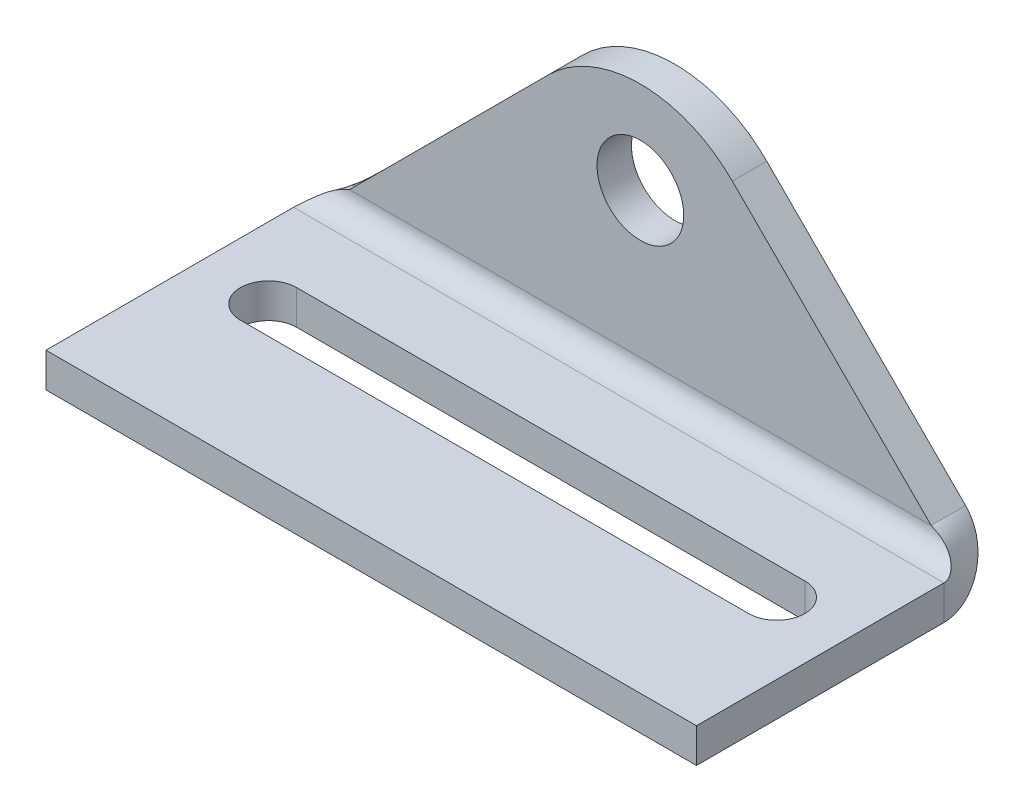
ISO-10303-21;
HEADER;
FILE_DESCRIPTION(('STEP AP214'),'2;1');
FILE_NAME('part.step','',(''),(''),'','','');
FILE_SCHEMA(('AUTOMOTIVE_DESIGN { 1 0 10303 214 1 1 1 1 }'));
ENDSEC;
DATA;
#1=APPLICATION_CONTEXT('core data for automotive mechanical design processes');
#2=APPLICATION_PROTOCOL_DEFINITION('international standard','automotive_design',2000,#1);
#3=PRODUCT_CONTEXT('',#1,'mechanical');
#4=PRODUCT('Part','Part','',(#3));
#5=PRODUCT_RELATED_PRODUCT_CATEGORY('part','',(#4));
#6=PRODUCT_DEFINITION_FORMATION('','',#4);
#7=PRODUCT_DEFINITION_CONTEXT('part definition',#1,'design');
#8=PRODUCT_DEFINITION('design','',#6,#7);
#9=PRODUCT_DEFINITION_SHAPE('','',#8);
#10=(LENGTH_UNIT() NAMED_UNIT(*) SI_UNIT(.MILLI.,.METRE.));
#11=(NAMED_UNIT(*) PLANE_ANGLE_UNIT() SI_UNIT($,.RADIAN.));
#12=(NAMED_UNIT(*) SI_UNIT($,.STERADIAN.) SOLID_ANGLE_UNIT());
#13=UNCERTAINTY_MEASURE_WITH_UNIT(LENGTH_MEASURE(1.E-05),#10,'distance_accuracy_value','');
#14=(GEOMETRIC_REPRESENTATION_CONTEXT(3) GLOBAL_UNCERTAINTY_ASSIGNED_CONTEXT((#13)) GLOBAL_UNIT_ASSIGNED_CONTEXT((#10,
#11,#12)) REPRESENTATION_CONTEXT('',''));
#15=CARTESIAN_POINT('',(0.,0.,0.));
#16=DIRECTION('',(0.,0.,1.));
#17=DIRECTION('',(1.,0.,0.));
#18=AXIS2_PLACEMENT_3D('',#15,#16,#17);
#19=CARTESIAN_POINT('',(58.5866542239858,-5.,35.0926454883733));
#20=DIRECTION('',(0.,-1.,0.));
#21=DIRECTION('',(0.,0.,-1.));
#22=AXIS2_PLACEMENT_3D('',#19,#20,#21);
#23=CYLINDRICAL_SURFACE('',#22,6.5);
#24=DIRECTION('',(0.,-1.,0.));
#25=VECTOR('',#24,1.);
#26=CARTESIAN_POINT('',(58.5866542239858,-5.,41.5926454883733));
#27=LINE('',#26,#25);
#28=CARTESIAN_POINT('',(58.5866542239858,2.9375,41.5926454883733));
#29=VERTEX_POINT('',#28);
#30=CARTESIAN_POINT('',(58.5866542239858,-5.,41.5926454883733));
#31=VERTEX_POINT('',#30);
#32=EDGE_CURVE('E11',#29,#31,#27,.T.);
#33=ORIENTED_EDGE('',*,*,#32,.F.);
#34=CARTESIAN_POINT('',(58.5866542239858,2.9375,35.0926454883733));
#35=DIRECTION('',(0.,-1.,0.));
#36=DIRECTION('',(0.,0.,-1.));
#37=AXIS2_PLACEMENT_3D('',#34,#35,#36);
#38=CIRCLE('',#37,6.5);
#39=CARTESIAN_POINT('',(58.5866542239858,2.9375,28.5926454883733));
#40=VERTEX_POINT('',#39);
#41=EDGE_CURVE('E122',#40,#29,#38,.T.);
#42=ORIENTED_EDGE('',*,*,#41,.F.);
#43=DIRECTION('',(0.,-1.,0.));
#44=VECTOR('',#43,1.);
#45=CARTESIAN_POINT('',(58.5866542239858,-5.,28.5926454883733));
#46=LINE('',#45,#44);
#47=CARTESIAN_POINT('',(58.5866542239858,-5.,28.5926454883733));
#48=VERTEX_POINT('',#47);
#49=EDGE_CURVE('E49',#40,#48,#46,.T.);
#50=ORIENTED_EDGE('',*,*,#49,.T.);
#51=CARTESIAN_POINT('',(58.5866542239858,-5.,35.0926454883733));
#52=DIRECTION('',(0.,-1.,0.));
#53=DIRECTION('',(0.,0.,-1.));
#54=AXIS2_PLACEMENT_3D('',#51,#52,#53);
#55=CIRCLE('',#54,6.5);
#56=EDGE_CURVE('E622',#48,#31,#55,.T.);
#57=ORIENTED_EDGE('',*,*,#56,.T.);
#58=EDGE_LOOP('',(#33,#42,#50,#57));
#59=FACE_BOUND('',#58,.T.);
#60=ADVANCED_FACE('F39',(#59),#23,.F.);
#61=CARTESIAN_POINT('',(-58.5866542239858,-5.,28.5926454883733));
#62=DIRECTION('',(0.,0.,1.));
#63=DIRECTION('',(1.,0.,0.));
#64=AXIS2_PLACEMENT_3D('',#61,#62,#63);
#65=PLANE('',#64);
#66=ORIENTED_EDGE('',*,*,#49,.F.);
#67=DIRECTION('',(1.,0.,0.));
#68=VECTOR('',#67,1.);
#69=CARTESIAN_POINT('',(0.,2.9375,28.5926454883733));
#70=LINE('',#69,#68);
#71=CARTESIAN_POINT('',(-58.5866542239858,2.9375,28.5926454883733));
#72=VERTEX_POINT('',#71);
#73=EDGE_CURVE('E134',#72,#40,#70,.T.);
#74=ORIENTED_EDGE('',*,*,#73,.F.);
#75=DIRECTION('',(0.,-1.,0.));
#76=VECTOR('',#75,1.);
#77=CARTESIAN_POINT('',(-58.5866542239858,-5.,28.5926454883733));
#78=LINE('',#77,#76);
#79=CARTESIAN_POINT('',(-58.5866542239858,-5.,28.5926454883733));
#80=VERTEX_POINT('',#79);
#81=EDGE_CURVE('E114',#72,#80,#78,.T.);
#82=ORIENTED_EDGE('',*,*,#81,.T.);
#83=DIRECTION('',(1.,0.,0.));
#84=VECTOR('',#83,1.);
#85=CARTESIAN_POINT('',(-58.5866542239858,-5.,28.5926454883733));
#86=LINE('',#85,#84);
#87=EDGE_CURVE('E624',#80,#48,#86,.T.);
#88=ORIENTED_EDGE('',*,*,#87,.T.);
#89=EDGE_LOOP('',(#66,#74,#82,#88));
#90=FACE_BOUND('',#89,.T.);
#91=ADVANCED_FACE('F353',(#90),#65,.T.);
#92=CARTESIAN_POINT('',(-58.5866542239858,-5.,35.0926454883733));
#93=DIRECTION('',(0.,-1.,0.));
#94=DIRECTION('',(0.,0.,-1.));
#95=AXIS2_PLACEMENT_3D('',#92,#93,#94);
#96=CYLINDRICAL_SURFACE('',#95,6.5);
#97=ORIENTED_EDGE('',*,*,#81,.F.);
#98=CARTESIAN_POINT('',(-58.5866542239858,2.9375,35.0926454883733));
#99=DIRECTION('',(0.,-1.,0.));
#100=DIRECTION('',(0.,0.,-1.));
#101=AXIS2_PLACEMENT_3D('',#98,#99,#100);
#102=CIRCLE('',#101,6.5);
#103=CARTESIAN_POINT('',(-58.5866542239858,2.9375,41.5926454883733));
#104=VERTEX_POINT('',#103);
#105=EDGE_CURVE('E120',#104,#72,#102,.T.);
#106=ORIENTED_EDGE('',*,*,#105,.F.);
#107=DIRECTION('',(0.,-1.,0.));
#108=VECTOR('',#107,1.);
#109=CARTESIAN_POINT('',(-58.5866542239858,-5.,41.5926454883733));
#110=LINE('',#109,#108);
#111=CARTESIAN_POINT('',(-58.5866542239858,-5.,41.5926454883733));
#112=VERTEX_POINT('',#111);
#113=EDGE_CURVE('E43',#104,#112,#110,.T.);
#114=ORIENTED_EDGE('',*,*,#113,.T.);
#115=CARTESIAN_POINT('',(-58.5866542239858,-5.,35.0926454883733));
#116=DIRECTION('',(0.,-1.,0.));
#117=DIRECTION('',(0.,0.,-1.));
#118=AXIS2_PLACEMENT_3D('',#115,#116,#117);
#119=CIRCLE('',#118,6.5);
#120=EDGE_CURVE('E616',#112,#80,#119,.T.);
#121=ORIENTED_EDGE('',*,*,#120,.T.);
#122=EDGE_LOOP('',(#97,#106,#114,#121));
#123=FACE_BOUND('',#122,.T.);
#124=ADVANCED_FACE('F124',(#123),#96,.F.);
#125=CARTESIAN_POINT('',(75.,-5.,0.));
#126=DIRECTION('',(-1.,0.,0.));
#127=DIRECTION('',(0.,0.,1.));
#128=AXIS2_PLACEMENT_3D('',#125,#126,#127);
#129=PLANE('',#128);
#130=CARTESIAN_POINT('',(75.,2.9375,12.9375));
#131=CARTESIAN_POINT('',(75.,-5.,12.9375));
#132=B_SPLINE_CURVE_WITH_KNOTS('',1,(#130,#131),.UNSPECIFIED.,.F.,.F.,(2,2),(0.,1.),.UNSPECIFIED.);
#133=CARTESIAN_POINT('',(75.,2.9375,12.9375));
#134=VERTEX_POINT('',#133);
#135=CARTESIAN_POINT('',(75.,-5.,12.9375));
#136=VERTEX_POINT('',#135);
#137=EDGE_CURVE('E115',#134,#136,#132,.T.);
#138=ORIENTED_EDGE('',*,*,#137,.F.);
#139=DIRECTION('',(0.,0.,1.));
#140=VECTOR('',#139,1.);
#141=CARTESIAN_POINT('',(75.,2.9375,0.));
#142=LINE('',#141,#140);
#143=CARTESIAN_POINT('',(75.,2.9375,70.));
#144=VERTEX_POINT('',#143);
#145=EDGE_CURVE('E129',#134,#144,#142,.T.);
#146=ORIENTED_EDGE('',*,*,#145,.T.);
#147=DIRECTION('',(0.,-1.,0.));
#148=VECTOR('',#147,1.);
#149=CARTESIAN_POINT('',(75.,-5.,70.));
#150=LINE('',#149,#148);
#151=CARTESIAN_POINT('',(75.,-5.,70.));
#152=VERTEX_POINT('',#151);
#153=EDGE_CURVE('E653',#144,#152,#150,.T.);
#154=ORIENTED_EDGE('',*,*,#153,.T.);
#155=DIRECTION('',(0.,0.,1.));
#156=VECTOR('',#155,1.);
#157=CARTESIAN_POINT('',(75.,-5.,0.));
#158=LINE('',#157,#156);
#159=EDGE_CURVE('E184',#136,#152,#158,.T.);
#160=ORIENTED_EDGE('',*,*,#159,.F.);
#161=EDGE_LOOP('',(#138,#146,#154,#160));
#162=FACE_BOUND('',#161,.T.);
#163=ADVANCED_FACE('F245',(#162),#129,.F.);
#164=CARTESIAN_POINT('',(-75.,-5.,70.));
#165=DIRECTION('',(0.,0.,-1.));
#166=DIRECTION('',(-1.,0.,0.));
#167=AXIS2_PLACEMENT_3D('',#164,#165,#166);
#168=PLANE('',#167);
#169=ORIENTED_EDGE('',*,*,#153,.F.);
#170=DIRECTION('',(1.,0.,0.));
#171=VECTOR('',#170,1.);
#172=CARTESIAN_POINT('',(0.,2.9375,70.));
#173=LINE('',#172,#171);
#174=CARTESIAN_POINT('',(-75.,2.9375,70.));
#175=VERTEX_POINT('',#174);
#176=EDGE_CURVE('E126',#144,#175,#173,.F.);
#177=ORIENTED_EDGE('',*,*,#176,.T.);
#178=DIRECTION('',(0.,-1.,0.));
#179=VECTOR('',#178,1.);
#180=CARTESIAN_POINT('',(-75.,-5.,70.));
#181=LINE('',#180,#179);
#182=CARTESIAN_POINT('',(-75.,-5.,70.));
#183=VERTEX_POINT('',#182);
#184=EDGE_CURVE('E566',#175,#183,#181,.T.);
#185=ORIENTED_EDGE('',*,*,#184,.T.);
#186=DIRECTION('',(-1.,0.,0.));
#187=VECTOR('',#186,1.);
#188=CARTESIAN_POINT('',(-75.,-5.,70.));
#189=LINE('',#188,#187);
#190=EDGE_CURVE('E614',#152,#183,#189,.T.);
#191=ORIENTED_EDGE('',*,*,#190,.F.);
#192=EDGE_LOOP('',(#169,#177,#185,#191));
#193=FACE_BOUND('',#192,.T.);
#194=ADVANCED_FACE('F346',(#193),#168,.F.);
#195=CARTESIAN_POINT('',(-75.,-5.,0.));
#196=DIRECTION('',(1.,0.,0.));
#197=DIRECTION('',(0.,0.,-1.));
#198=AXIS2_PLACEMENT_3D('',#195,#196,#197);
#199=PLANE('',#198);
#200=ORIENTED_EDGE('',*,*,#184,.F.);
#201=DIRECTION('',(0.,0.,1.));
#202=VECTOR('',#201,1.);
#203=CARTESIAN_POINT('',(-75.,2.9375,0.));
#204=LINE('',#203,#202);
#205=CARTESIAN_POINT('',(-75.,2.9375,12.9375));
#206=VERTEX_POINT('',#205);
#207=EDGE_CURVE('E561',#175,#206,#204,.F.);
#208=ORIENTED_EDGE('',*,*,#207,.T.);
#209=CARTESIAN_POINT('',(-75.,-5.,12.9375));
#210=CARTESIAN_POINT('',(-75.,2.9375,12.9375));
#211=B_SPLINE_CURVE_WITH_KNOTS('',1,(#209,#210),.UNSPECIFIED.,.F.,.F.,(2,2),(0.,1.),.UNSPECIFIED.);
#212=CARTESIAN_POINT('',(-75.,-5.,12.9375));
#213=VERTEX_POINT('',#212);
#214=EDGE_CURVE('E332',#206,#213,#211,.F.);
#215=ORIENTED_EDGE('',*,*,#214,.T.);
#216=DIRECTION('',(0.,0.,-1.));
#217=VECTOR('',#216,1.);
#218=CARTESIAN_POINT('',(-75.,-5.,0.));
#219=LINE('',#218,#217);
#220=EDGE_CURVE('E595',#183,#213,#219,.T.);
#221=ORIENTED_EDGE('',*,*,#220,.F.);
#222=EDGE_LOOP('',(#200,#208,#215,#221));
#223=FACE_BOUND('',#222,.T.);
#224=ADVANCED_FACE('F338',(#223),#199,.F.);
#225=CARTESIAN_POINT('',(-67.0625,7.9375,0.));
#226=CARTESIAN_POINT('',(-68.2358253863318,6.76417461366818,0.));
#227=CARTESIAN_POINT('',(-69.3214078149922,5.3098402804112,0.168234919611068));
#228=CARTESIAN_POINT('',(-71.2503925812403,2.26714685473568,1.1984275705795));
#229=CARTESIAN_POINT('',(-72.0956789091576,0.685577328023532,2.0682324498189));
#230=CARTESIAN_POINT('',(-73.4924492208269,-2.04574813589976,4.50742786657195));
#231=CARTESIAN_POINT('',(-74.0439332045788,-3.18278866522983,6.07171407639348));
#232=CARTESIAN_POINT('',(-74.7977085941654,-4.66111410639901,9.46262461448235));
#233=CARTESIAN_POINT('',(-75.,-5.,11.2770801997747));
#234=CARTESIAN_POINT('',(-75.,-5.,12.9375));
#235=CARTESIAN_POINT('',(-67.0625,7.9375,7.9375));
#236=CARTESIAN_POINT('',(-68.2372197205016,7.48350204038588,7.9375));
#237=CARTESIAN_POINT('',(-69.3214078149922,6.92197933542462,8.00251832641974));
#238=CARTESIAN_POINT('',(-71.2503925812403,5.74605917091234,8.40066041375053));
#239=CARTESIAN_POINT('',(-72.0956789091576,5.13482457121682,8.7368168888189));
#240=CARTESIAN_POINT('',(-73.4924492208269,4.07923985086,9.6795011078539));
#241=CARTESIAN_POINT('',(-74.0439332045788,3.63980389749572,10.2840561647897));
#242=CARTESIAN_POINT('',(-74.7977085941654,3.06847039366222,11.5945529911043));
#243=CARTESIAN_POINT('',(-75.,2.9375,12.2957918646472));
#244=CARTESIAN_POINT('',(-75.,2.9375,12.9375));
#245=B_SPLINE_SURFACE_WITH_KNOTS('',1,3,((#225,#226,#227,#228,#229,#230,#231,#232,#233,#234),
(#235,#236,#237,#238,#239,#240,#241,#242,#243,#244)),.UNSPECIFIED.,.F.,.F.,.F.,(2,2),(4,2,2,2,
4),(0.,1.),(0.,0.25,0.5,0.75,1.),.UNSPECIFIED.);
#246=CARTESIAN_POINT('',(-75.,2.9375,12.9375));
#247=CARTESIAN_POINT('',(-75.,2.9375,12.2957918646472));
#248=CARTESIAN_POINT('',(-74.7977085941654,3.06847039366222,11.5945529911043));
#249=CARTESIAN_POINT('',(-74.0439332045788,3.63980389749572,10.2840561647897));
#250=CARTESIAN_POINT('',(-73.4924492208269,4.07923985086,9.6795011078539));
#251=CARTESIAN_POINT('',(-72.0956789091576,5.13482457121682,8.7368168888189));
#252=CARTESIAN_POINT('',(-71.2503925812403,5.74605917091234,8.40066041375053));
#253=CARTESIAN_POINT('',(-69.3214078149922,6.92197933542462,8.00251832641974));
#254=CARTESIAN_POINT('',(-68.2372197205016,7.48350204038588,7.9375));
#255=CARTESIAN_POINT('',(-67.0625,7.9375,7.9375));
#256=B_SPLINE_CURVE_WITH_KNOTS('',3,(#246,#247,#248,#249,#250,#251,#252,#253,#254,#255),
.UNSPECIFIED.,.F.,.F.,(4,2,2,2,4),(0.,0.25,0.5,0.75,1.),.UNSPECIFIED.);
#257=CARTESIAN_POINT('',(-67.0625,7.9375,7.9375));
#258=VERTEX_POINT('',#257);
#259=EDGE_CURVE('E555',#206,#258,#256,.T.);
#260=CARTESIAN_POINT('',(-67.0625,7.9375,7.9375));
#261=CARTESIAN_POINT('',(-67.0625,7.9375,0.));
#262=B_SPLINE_CURVE_WITH_KNOTS('',1,(#260,#261),.UNSPECIFIED.,.F.,.F.,(2,2),(0.,1.),.UNSPECIFIED.);
#263=CARTESIAN_POINT('',(-67.0625,7.9375,0.));
#264=VERTEX_POINT('',#263);
#265=EDGE_CURVE('E57',#258,#264,#262,.T.);
#266=CARTESIAN_POINT('',(-67.0625,7.9375,0.));
#267=CARTESIAN_POINT('',(-68.2358253863318,6.76417461366818,0.));
#268=CARTESIAN_POINT('',(-69.3214078149922,5.3098402804112,0.168234919611068));
#269=CARTESIAN_POINT('',(-71.2503925812403,2.26714685473568,1.1984275705795));
#270=CARTESIAN_POINT('',(-72.0956789091576,0.685577328023532,2.0682324498189));
#271=CARTESIAN_POINT('',(-73.4924492208269,-2.04574813589976,4.50742786657195));
#272=CARTESIAN_POINT('',(-74.0439332045788,-3.18278866522983,6.07171407639348));
#273=CARTESIAN_POINT('',(-74.7977085941654,-4.66111410639901,9.46262461448235));
#274=CARTESIAN_POINT('',(-75.,-5.,11.2770801997747));
#275=CARTESIAN_POINT('',(-75.,-5.,12.9375));
#276=B_SPLINE_CURVE_WITH_KNOTS('',3,(#266,#267,#268,#269,#270,#271,#272,#273,#274,#275),
.UNSPECIFIED.,.F.,.F.,(4,2,2,2,4),(0.,0.25,0.5,0.75,1.),.UNSPECIFIED.);
#277=EDGE_CURVE('E576',#213,#264,#276,.F.);
#278=ORIENTED_EDGE('',*,*,#214,.F.);
#279=ORIENTED_EDGE('',*,*,#259,.T.);
#280=ORIENTED_EDGE('',*,*,#265,.T.);
#281=ORIENTED_EDGE('',*,*,#277,.F.);
#282=EDGE_LOOP('',(#278,#279,#280,#281));
#283=FACE_BOUND('',#282,.T.);
#284=ADVANCED_FACE('F309',(#283),#245,.F.);
#285=CARTESIAN_POINT('',(-75.,0.,0.));
#286=DIRECTION('',(0.707106781186549,-0.707106781186546,0.));
#287=DIRECTION('',(-0.707106781186546,-0.707106781186549,0.));
#288=AXIS2_PLACEMENT_3D('',#285,#286,#287);
#289=PLANE('',#288);
#290=ORIENTED_EDGE('',*,*,#265,.F.);
#291=DIRECTION('',(-0.707106781186546,-0.707106781186549,0.));
#292=VECTOR('',#291,1.);
#293=CARTESIAN_POINT('',(-75.,0.,7.9375));
#294=LINE('',#293,#292);
#295=CARTESIAN_POINT('',(-21.2132034355966,53.7867965644036,7.9375));
#296=VERTEX_POINT('',#295);
#297=EDGE_CURVE('E145',#296,#258,#294,.T.);
#298=ORIENTED_EDGE('',*,*,#297,.F.);
#299=DIRECTION('',(0.,0.,-1.));
#300=VECTOR('',#299,1.);
#301=CARTESIAN_POINT('',(-21.2132034355966,53.7867965644036,0.));
#302=LINE('',#301,#300);
#303=CARTESIAN_POINT('',(-21.2132034355966,53.7867965644036,0.));
#304=VERTEX_POINT('',#303);
#305=EDGE_CURVE('E635',#296,#304,#302,.T.);
#306=ORIENTED_EDGE('',*,*,#305,.T.);
#307=DIRECTION('',(-0.707106781186546,-0.707106781186549,0.));
#308=VECTOR('',#307,1.);
#309=CARTESIAN_POINT('',(-75.,0.,0.));
#310=LINE('',#309,#308);
#311=EDGE_CURVE('E155',#304,#264,#310,.T.);
#312=ORIENTED_EDGE('',*,*,#311,.T.);
#313=EDGE_LOOP('',(#290,#298,#306,#312));
#314=FACE_BOUND('',#313,.T.);
#315=ADVANCED_FACE('F304',(#314),#289,.F.);
#316=CARTESIAN_POINT('',(0.,32.5735931288073,0.));
#317=DIRECTION('',(0.,0.,1.));
#318=DIRECTION('',(1.,0.,0.));
#319=AXIS2_PLACEMENT_3D('',#316,#317,#318);
#320=CYLINDRICAL_SURFACE('',#319,30.);
#321=ORIENTED_EDGE('',*,*,#305,.F.);
#322=CARTESIAN_POINT('',(0.,32.5735931288073,7.9375));
#323=DIRECTION('',(0.,0.,1.));
#324=DIRECTION('',(1.,0.,0.));
#325=AXIS2_PLACEMENT_3D('',#322,#323,#324);
#326=CIRCLE('',#325,30.);
#327=CARTESIAN_POINT('',(21.2132034355966,53.7867965644036,7.9375));
#328=VERTEX_POINT('',#327);
#329=EDGE_CURVE('E136',#328,#296,#326,.T.);
#330=ORIENTED_EDGE('',*,*,#329,.F.);
#331=DIRECTION('',(0.,0.,-1.));
#332=VECTOR('',#331,1.);
#333=CARTESIAN_POINT('',(21.2132034355966,53.7867965644036,0.));
#334=LINE('',#333,#332);
#335=CARTESIAN_POINT('',(21.2132034355966,53.7867965644036,0.));
#336=VERTEX_POINT('',#335);
#337=EDGE_CURVE('E637',#328,#336,#334,.T.);
#338=ORIENTED_EDGE('',*,*,#337,.T.);
#339=CARTESIAN_POINT('',(0.,32.5735931288073,0.));
#340=DIRECTION('',(0.,0.,1.));
#341=DIRECTION('',(-1.,0.,0.));
#342=AXIS2_PLACEMENT_3D('',#339,#340,#341);
#343=CIRCLE('',#342,30.);
#344=EDGE_CURVE('E202',#336,#304,#343,.T.);
#345=ORIENTED_EDGE('',*,*,#344,.T.);
#346=EDGE_LOOP('',(#321,#330,#338,#345));
#347=FACE_BOUND('',#346,.T.);
#348=ADVANCED_FACE('F301',(#347),#320,.T.);
#349=CARTESIAN_POINT('',(21.2132034355966,53.7867965644036,0.));
#350=DIRECTION('',(-0.707106781186549,-0.707106781186546,0.));
#351=DIRECTION('',(-0.707106781186546,0.707106781186549,0.));
#352=AXIS2_PLACEMENT_3D('',#349,#350,#351);
#353=PLANE('',#352);
#354=ORIENTED_EDGE('',*,*,#337,.F.);
#355=DIRECTION('',(-0.707106781186546,0.707106781186549,0.));
#356=VECTOR('',#355,1.);
#357=CARTESIAN_POINT('',(21.2132034355966,53.7867965644036,7.9375));
#358=LINE('',#357,#356);
#359=CARTESIAN_POINT('',(67.0625,7.93750000000001,7.9375));
#360=VERTEX_POINT('',#359);
#361=EDGE_CURVE('E148',#360,#328,#358,.T.);
#362=ORIENTED_EDGE('',*,*,#361,.F.);
#363=CARTESIAN_POINT('',(67.0625,7.9375,0.));
#364=CARTESIAN_POINT('',(67.0625,7.9375,7.9375));
#365=B_SPLINE_CURVE_WITH_KNOTS('',1,(#363,#364),.UNSPECIFIED.,.F.,.F.,(2,2),(0.,1.),.UNSPECIFIED.);
#366=CARTESIAN_POINT('',(67.0625,7.93750000000001,0.));
#367=VERTEX_POINT('',#366);
#368=EDGE_CURVE('E285',#360,#367,#365,.F.);
#369=ORIENTED_EDGE('',*,*,#368,.T.);
#370=DIRECTION('',(-0.707106781186546,0.707106781186549,0.));
#371=VECTOR('',#370,1.);
#372=CARTESIAN_POINT('',(21.2132034355966,53.7867965644036,0.));
#373=LINE('',#372,#371);
#374=EDGE_CURVE('E199',#367,#336,#373,.T.);
#375=ORIENTED_EDGE('',*,*,#374,.T.);
#376=EDGE_LOOP('',(#354,#362,#369,#375));
#377=FACE_BOUND('',#376,.T.);
#378=ADVANCED_FACE('F291',(#377),#353,.F.);
#379=CARTESIAN_POINT('',(-58.5866542239858,-5.,41.5926454883733));
#380=DIRECTION('',(0.,0.,-1.));
#381=DIRECTION('',(-1.,0.,0.));
#382=AXIS2_PLACEMENT_3D('',#379,#380,#381);
#383=PLANE('',#382);
#384=DIRECTION('',(1.,0.,0.));
#385=VECTOR('',#384,1.);
#386=CARTESIAN_POINT('',(0.,2.9375,41.5926454883733));
#387=LINE('',#386,#385);
#388=EDGE_CURVE('E106',#29,#104,#387,.F.);
#389=ORIENTED_EDGE('',*,*,#388,.F.);
#390=ORIENTED_EDGE('',*,*,#32,.T.);
#391=DIRECTION('',(-1.,0.,0.));
#392=VECTOR('',#391,1.);
#393=CARTESIAN_POINT('',(-58.5866542239858,-5.,41.5926454883733));
#394=LINE('',#393,#392);
#395=EDGE_CURVE('E109',#31,#112,#394,.T.);
#396=ORIENTED_EDGE('',*,*,#395,.T.);
#397=ORIENTED_EDGE('',*,*,#113,.F.);
#398=EDGE_LOOP('',(#389,#390,#396,#397));
#399=FACE_BOUND('',#398,.T.);
#400=ADVANCED_FACE('F41',(#399),#383,.T.);
#401=CARTESIAN_POINT('',(75.,-5.,12.9375));
#402=CARTESIAN_POINT('',(75.,-5.,11.2770801997747));
#403=CARTESIAN_POINT('',(74.7977085941654,-4.66111410639901,9.46262461448235));
#404=CARTESIAN_POINT('',(74.0439332045788,-3.18278866522983,6.07171407639348));
#405=CARTESIAN_POINT('',(73.4924492208268,-2.04574813589976,4.50742786657195));
#406=CARTESIAN_POINT('',(72.0956789091576,0.685577328023532,2.0682324498189));
#407=CARTESIAN_POINT('',(71.2503925812403,2.26714685473568,1.1984275705795));
#408=CARTESIAN_POINT('',(69.3214078149922,5.3098402804112,0.168234919611068));
#409=CARTESIAN_POINT('',(68.2358253863318,6.76417461366818,0.));
#410=CARTESIAN_POINT('',(67.0625,7.9375,0.));
#411=CARTESIAN_POINT('',(75.,2.9375,12.9375));
#412=CARTESIAN_POINT('',(75.,2.9375,12.2957918646472));
#413=CARTESIAN_POINT('',(74.7977085941654,3.06847039366222,11.5945529911043));
#414=CARTESIAN_POINT('',(74.0439332045788,3.63980389749572,10.2840561647897));
#415=CARTESIAN_POINT('',(73.4924492208268,4.07923985086,9.6795011078539));
#416=CARTESIAN_POINT('',(72.0956789091576,5.13482457121682,8.7368168888189));
#417=CARTESIAN_POINT('',(71.2503925812403,5.74605917091234,8.40066041375053));
#418=CARTESIAN_POINT('',(69.3214078149922,6.92197933542462,8.00251832641974));
#419=CARTESIAN_POINT('',(68.2372197205015,7.48350204038589,7.9375));
#420=CARTESIAN_POINT('',(67.0625,7.9375,7.9375));
#421=B_SPLINE_SURFACE_WITH_KNOTS('',1,3,((#401,#402,#403,#404,#405,#406,#407,#408,#409,#410),
(#411,#412,#413,#414,#415,#416,#417,#418,#419,#420)),.UNSPECIFIED.,.F.,.F.,.F.,(2,2),(4,2,2,2,
4),(0.,1.),(0.,0.25,0.5,0.75,1.),.UNSPECIFIED.);
#422=CARTESIAN_POINT('',(67.0625,7.9375,7.9375));
#423=CARTESIAN_POINT('',(68.2372197205015,7.48350204038589,7.9375));
#424=CARTESIAN_POINT('',(69.3214078149922,6.92197933542462,8.00251832641974));
#425=CARTESIAN_POINT('',(71.2503925812403,5.74605917091234,8.40066041375053));
#426=CARTESIAN_POINT('',(72.0956789091576,5.13482457121682,8.7368168888189));
#427=CARTESIAN_POINT('',(73.4924492208268,4.07923985086,9.6795011078539));
#428=CARTESIAN_POINT('',(74.0439332045788,3.63980389749572,10.2840561647897));
#429=CARTESIAN_POINT('',(74.7977085941654,3.06847039366222,11.5945529911043));
#430=CARTESIAN_POINT('',(75.,2.9375,12.2957918646472));
#431=CARTESIAN_POINT('',(75.,2.9375,12.9375));
#432=B_SPLINE_CURVE_WITH_KNOTS('',3,(#422,#423,#424,#425,#426,#427,#428,#429,#430,#431),
.UNSPECIFIED.,.F.,.F.,(4,2,2,2,4),(0.,0.25,0.5,0.75,1.),.UNSPECIFIED.);
#433=EDGE_CURVE('E210',#360,#134,#432,.T.);
#434=CARTESIAN_POINT('',(75.,-5.,12.9375));
#435=CARTESIAN_POINT('',(75.,-5.,11.2770801997747));
#436=CARTESIAN_POINT('',(74.7977085941654,-4.66111410639901,9.46262461448235));
#437=CARTESIAN_POINT('',(74.0439332045788,-3.18278866522983,6.07171407639348));
#438=CARTESIAN_POINT('',(73.4924492208268,-2.04574813589976,4.50742786657195));
#439=CARTESIAN_POINT('',(72.0956789091576,0.685577328023532,2.0682324498189));
#440=CARTESIAN_POINT('',(71.2503925812403,2.26714685473568,1.1984275705795));
#441=CARTESIAN_POINT('',(69.3214078149922,5.3098402804112,0.168234919611068));
#442=CARTESIAN_POINT('',(68.2358253863318,6.76417461366818,0.));
#443=CARTESIAN_POINT('',(67.0625,7.9375,0.));
#444=B_SPLINE_CURVE_WITH_KNOTS('',3,(#434,#435,#436,#437,#438,#439,#440,#441,#442,#443),
.UNSPECIFIED.,.F.,.F.,(4,2,2,2,4),(0.,0.25,0.5,0.75,1.),.UNSPECIFIED.);
#445=EDGE_CURVE('E141',#367,#136,#444,.F.);
#446=ORIENTED_EDGE('',*,*,#433,.T.);
#447=ORIENTED_EDGE('',*,*,#137,.T.);
#448=ORIENTED_EDGE('',*,*,#445,.F.);
#449=ORIENTED_EDGE('',*,*,#368,.F.);
#450=EDGE_LOOP('',(#446,#447,#448,#449));
#451=FACE_BOUND('',#450,.T.);
#452=ADVANCED_FACE('F232',(#451),#421,.F.);
#453=CARTESIAN_POINT('',(0.,41.325890400855,0.));
#454=DIRECTION('',(0.,0.,1.));
#455=DIRECTION('',(1.,0.,0.));
#456=AXIS2_PLACEMENT_3D('',#453,#454,#455);
#457=CYLINDRICAL_SURFACE('',#456,10.);
#458=CARTESIAN_POINT('',(0.,41.325890400855,0.));
#459=DIRECTION('',(0.,0.,1.));
#460=DIRECTION('',(1.,0.,0.));
#461=AXIS2_PLACEMENT_3D('',#458,#459,#460);
#462=CIRCLE('',#461,10.);
#463=CARTESIAN_POINT('',(10.,41.325890400855,0.));
#464=VERTEX_POINT('',#463);
#465=EDGE_CURVE('E600',#464,#464,#462,.T.);
#466=ORIENTED_EDGE('',*,*,#465,.F.);
#467=EDGE_LOOP('',(#466));
#468=FACE_BOUND('',#467,.T.);
#469=CARTESIAN_POINT('',(0.,41.325890400855,7.9375));
#470=DIRECTION('',(0.,0.,1.));
#471=DIRECTION('',(1.,0.,0.));
#472=AXIS2_PLACEMENT_3D('',#469,#470,#471);
#473=CIRCLE('',#472,10.);
#474=CARTESIAN_POINT('',(10.,41.325890400855,7.9375));
#475=VERTEX_POINT('',#474);
#476=EDGE_CURVE('E133',#475,#475,#473,.T.);
#477=ORIENTED_EDGE('',*,*,#476,.T.);
#478=EDGE_LOOP('',(#477));
#479=FACE_BOUND('',#478,.T.);
#480=ADVANCED_FACE('F244',(#468,#479),#457,.F.);
#481=CARTESIAN_POINT('',(0.,32.5735931288073,0.));
#482=DIRECTION('',(0.,0.,-1.));
#483=DIRECTION('',(-1.,0.,0.));
#484=AXIS2_PLACEMENT_3D('',#481,#482,#483);
#485=PLANE('',#484);
#486=ORIENTED_EDGE('',*,*,#374,.F.);
#487=DIRECTION('',(1.,0.,0.));
#488=VECTOR('',#487,1.);
#489=CARTESIAN_POINT('',(-75.,7.9375,0.));
#490=LINE('',#489,#488);
#491=EDGE_CURVE('E599',#367,#264,#490,.F.);
#492=ORIENTED_EDGE('',*,*,#491,.T.);
#493=ORIENTED_EDGE('',*,*,#311,.F.);
#494=ORIENTED_EDGE('',*,*,#344,.F.);
#495=EDGE_LOOP('',(#486,#492,#493,#494));
#496=FACE_BOUND('',#495,.T.);
#497=ORIENTED_EDGE('',*,*,#465,.T.);
#498=EDGE_LOOP('',(#497));
#499=FACE_BOUND('',#498,.T.);
#500=ADVANCED_FACE('F171',(#496,#499),#485,.T.);
#501=CARTESIAN_POINT('',(0.,-5.,0.));
#502=DIRECTION('',(0.,1.,0.));
#503=DIRECTION('',(0.,0.,1.));
#504=AXIS2_PLACEMENT_3D('',#501,#502,#503);
#505=PLANE('',#504);
#506=ORIENTED_EDGE('',*,*,#220,.T.);
#507=DIRECTION('',(1.,0.,0.));
#508=VECTOR('',#507,1.);
#509=CARTESIAN_POINT('',(75.,-5.,12.9375));
#510=LINE('',#509,#508);
#511=EDGE_CURVE('E597',#213,#136,#510,.T.);
#512=ORIENTED_EDGE('',*,*,#511,.T.);
#513=ORIENTED_EDGE('',*,*,#159,.T.);
#514=ORIENTED_EDGE('',*,*,#190,.T.);
#515=EDGE_LOOP('',(#506,#512,#513,#514));
#516=FACE_BOUND('',#515,.T.);
#517=ORIENTED_EDGE('',*,*,#120,.F.);
#518=ORIENTED_EDGE('',*,*,#395,.F.);
#519=ORIENTED_EDGE('',*,*,#56,.F.);
#520=ORIENTED_EDGE('',*,*,#87,.F.);
#521=EDGE_LOOP('',(#517,#518,#519,#520));
#522=FACE_BOUND('',#521,.T.);
#523=ADVANCED_FACE('F169',(#516,#522),#505,.F.);
#524=CARTESIAN_POINT('',(0.,7.9375,12.9375));
#525=DIRECTION('',(-1.,0.,0.));
#526=DIRECTION('',(0.,0.,1.));
#527=AXIS2_PLACEMENT_3D('',#524,#525,#526);
#528=CYLINDRICAL_SURFACE('',#527,12.9375);
#529=ORIENTED_EDGE('',*,*,#277,.T.);
#530=ORIENTED_EDGE('',*,*,#491,.F.);
#531=ORIENTED_EDGE('',*,*,#445,.T.);
#532=ORIENTED_EDGE('',*,*,#511,.F.);
#533=EDGE_LOOP('',(#529,#530,#531,#532));
#534=FACE_BOUND('',#533,.T.);
#535=ADVANCED_FACE('F158',(#534),#528,.T.);
#536=CARTESIAN_POINT('',(0.,32.5735931288073,7.9375));
#537=DIRECTION('',(0.,0.,-1.));
#538=DIRECTION('',(-1.,0.,0.));
#539=AXIS2_PLACEMENT_3D('',#536,#537,#538);
#540=PLANE('',#539);
#541=ORIENTED_EDGE('',*,*,#361,.T.);
#542=ORIENTED_EDGE('',*,*,#329,.T.);
#543=ORIENTED_EDGE('',*,*,#297,.T.);
#544=DIRECTION('',(-1.,0.,0.));
#545=VECTOR('',#544,1.);
#546=CARTESIAN_POINT('',(0.,7.93750000000001,7.9375));
#547=LINE('',#546,#545);
#548=EDGE_CURVE('E138',#360,#258,#547,.T.);
#549=ORIENTED_EDGE('',*,*,#548,.F.);
#550=EDGE_LOOP('',(#541,#542,#543,#549));
#551=FACE_BOUND('',#550,.T.);
#552=ORIENTED_EDGE('',*,*,#476,.F.);
#553=EDGE_LOOP('',(#552));
#554=FACE_BOUND('',#553,.T.);
#555=ADVANCED_FACE('F168',(#551,#554),#540,.F.);
#556=CARTESIAN_POINT('',(0.,2.9375,0.));
#557=DIRECTION('',(0.,1.,0.));
#558=DIRECTION('',(0.,0.,1.));
#559=AXIS2_PLACEMENT_3D('',#556,#557,#558);
#560=PLANE('',#559);
#561=ORIENTED_EDGE('',*,*,#207,.F.);
#562=ORIENTED_EDGE('',*,*,#176,.F.);
#563=ORIENTED_EDGE('',*,*,#145,.F.);
#564=DIRECTION('',(1.,0.,0.));
#565=VECTOR('',#564,1.);
#566=CARTESIAN_POINT('',(0.,2.9375,12.9375));
#567=LINE('',#566,#565);
#568=EDGE_CURVE('E142',#206,#134,#567,.T.);
#569=ORIENTED_EDGE('',*,*,#568,.F.);
#570=EDGE_LOOP('',(#561,#562,#563,#569));
#571=FACE_BOUND('',#570,.T.);
#572=ORIENTED_EDGE('',*,*,#105,.T.);
#573=ORIENTED_EDGE('',*,*,#73,.T.);
#574=ORIENTED_EDGE('',*,*,#41,.T.);
#575=ORIENTED_EDGE('',*,*,#388,.T.);
#576=EDGE_LOOP('',(#572,#573,#574,#575));
#577=FACE_BOUND('',#576,.T.);
#578=ADVANCED_FACE('F118',(#571,#577),#560,.T.);
#579=CARTESIAN_POINT('',(0.,7.9375,12.9375));
#580=DIRECTION('',(-1.,0.,0.));
#581=DIRECTION('',(0.,0.,1.));
#582=AXIS2_PLACEMENT_3D('',#579,#580,#581);
#583=CYLINDRICAL_SURFACE('',#582,5.);
#584=ORIENTED_EDGE('',*,*,#259,.F.);
#585=ORIENTED_EDGE('',*,*,#568,.T.);
#586=ORIENTED_EDGE('',*,*,#433,.F.);
#587=ORIENTED_EDGE('',*,*,#548,.T.);
#588=EDGE_LOOP('',(#584,#585,#586,#587));
#589=FACE_BOUND('',#588,.T.);
#590=ADVANCED_FACE('F173',(#589),#583,.F.);
#591=CLOSED_SHELL('',(#60,#91,#124,#163,#194,#224,#284,#315,#348,#378,#400,#452,#480,#500,#523,
#535,#555,#578,#590));
#592=MANIFOLD_SOLID_BREP('B2',#591);
#593=ADVANCED_BREP_SHAPE_REPRESENTATION('',(#18,#592),#14);
#594=SHAPE_DEFINITION_REPRESENTATION(#9,#593);
ENDSEC;
END-ISO-10303-21;
